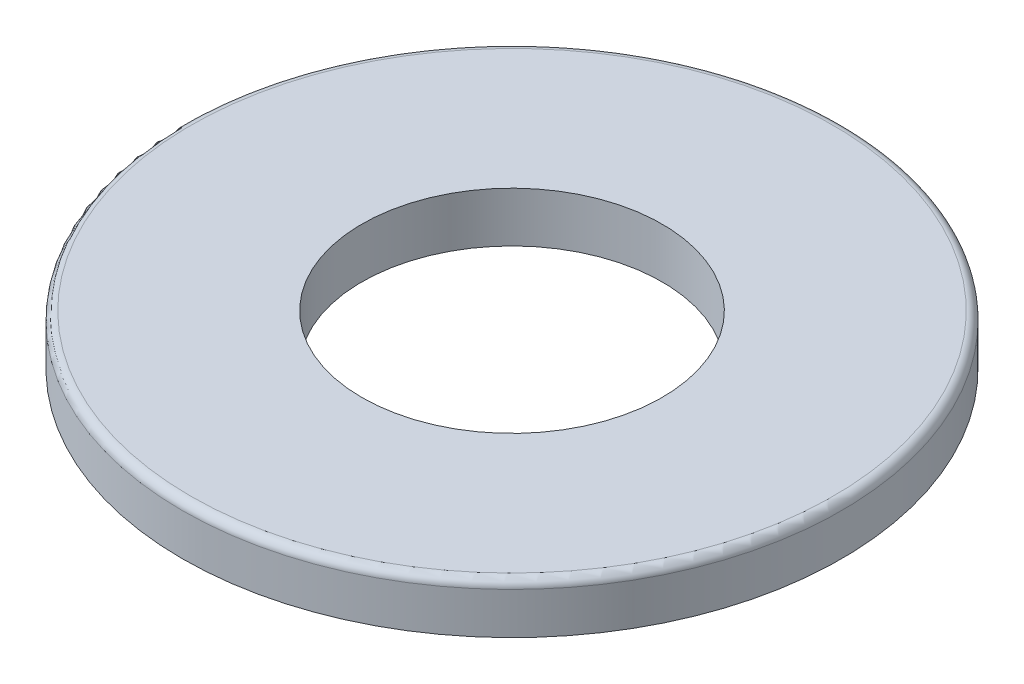
ISO-10303-21;
HEADER;
FILE_DESCRIPTION(('STEP AP214'),'2;1');
FILE_NAME('part.step','',(''),(''),'','','');
FILE_SCHEMA(('AUTOMOTIVE_DESIGN { 1 0 10303 214 1 1 1 1 }'));
ENDSEC;
DATA;
#1=APPLICATION_CONTEXT('core data for automotive mechanical design processes');
#2=APPLICATION_PROTOCOL_DEFINITION('international standard','automotive_design',2000,#1);
#3=PRODUCT_CONTEXT('',#1,'mechanical');
#4=PRODUCT('Part','Part','',(#3));
#5=PRODUCT_RELATED_PRODUCT_CATEGORY('part','',(#4));
#6=PRODUCT_DEFINITION_FORMATION('','',#4);
#7=PRODUCT_DEFINITION_CONTEXT('part definition',#1,'design');
#8=PRODUCT_DEFINITION('design','',#6,#7);
#9=PRODUCT_DEFINITION_SHAPE('','',#8);
#10=(LENGTH_UNIT() NAMED_UNIT(*) SI_UNIT(.MILLI.,.METRE.));
#11=(NAMED_UNIT(*) PLANE_ANGLE_UNIT() SI_UNIT($,.RADIAN.));
#12=(NAMED_UNIT(*) SI_UNIT($,.STERADIAN.) SOLID_ANGLE_UNIT());
#13=UNCERTAINTY_MEASURE_WITH_UNIT(LENGTH_MEASURE(1.E-05),#10,'distance_accuracy_value','');
#14=(GEOMETRIC_REPRESENTATION_CONTEXT(3) GLOBAL_UNCERTAINTY_ASSIGNED_CONTEXT((#13)) GLOBAL_UNIT_ASSIGNED_CONTEXT((#10,
#11,#12)) REPRESENTATION_CONTEXT('',''));
#15=CARTESIAN_POINT('',(0.,0.,0.));
#16=DIRECTION('',(0.,0.,1.));
#17=DIRECTION('',(1.,0.,0.));
#18=AXIS2_PLACEMENT_3D('',#15,#16,#17);
#19=CARTESIAN_POINT('',(0.,1.2,0.));
#20=DIRECTION('',(0.,-1.,0.));
#21=DIRECTION('',(0.,0.,-1.));
#22=AXIS2_PLACEMENT_3D('',#19,#20,#21);
#23=CYLINDRICAL_SURFACE('',#22,7.9);
#24=CARTESIAN_POINT('',(0.,1.,0.));
#25=DIRECTION('',(0.,1.,0.));
#26=DIRECTION('',(0.,0.,1.));
#27=AXIS2_PLACEMENT_3D('',#24,#25,#26);
#28=CIRCLE('',#27,7.9);
#29=CARTESIAN_POINT('',(0.,1.,7.9));
#30=VERTEX_POINT('',#29);
#31=EDGE_CURVE('E10',#30,#30,#28,.F.);
#32=ORIENTED_EDGE('',*,*,#31,.T.);
#33=EDGE_LOOP('',(#32));
#34=FACE_BOUND('',#33,.T.);
#35=CARTESIAN_POINT('',(0.,0.,0.));
#36=DIRECTION('',(0.,1.,0.));
#37=DIRECTION('',(0.,0.,1.));
#38=AXIS2_PLACEMENT_3D('',#35,#36,#37);
#39=CIRCLE('',#38,7.9);
#40=CARTESIAN_POINT('',(0.,0.,7.9));
#41=VERTEX_POINT('',#40);
#42=EDGE_CURVE('E42',#41,#41,#39,.T.);
#43=ORIENTED_EDGE('',*,*,#42,.T.);
#44=EDGE_LOOP('',(#43));
#45=FACE_BOUND('',#44,.T.);
#46=ADVANCED_FACE('F31',(#34,#45),#23,.T.);
#47=CARTESIAN_POINT('',(0.,1.2,0.));
#48=DIRECTION('',(0.,1.,0.));
#49=DIRECTION('',(0.,0.,1.));
#50=AXIS2_PLACEMENT_3D('',#47,#48,#49);
#51=PLANE('',#50);
#52=CARTESIAN_POINT('',(0.,1.2,0.));
#53=DIRECTION('',(0.,1.,0.));
#54=DIRECTION('',(0.,0.,1.));
#55=AXIS2_PLACEMENT_3D('',#52,#53,#54);
#56=CIRCLE('',#55,7.7);
#57=CARTESIAN_POINT('',(0.,1.2,7.7));
#58=VERTEX_POINT('',#57);
#59=EDGE_CURVE('E38',#58,#58,#56,.T.);
#60=ORIENTED_EDGE('',*,*,#59,.T.);
#61=EDGE_LOOP('',(#60));
#62=FACE_BOUND('',#61,.T.);
#63=CARTESIAN_POINT('',(0.,1.2,0.));
#64=DIRECTION('',(0.,1.,0.));
#65=DIRECTION('',(0.,0.,1.));
#66=AXIS2_PLACEMENT_3D('',#63,#64,#65);
#67=CIRCLE('',#66,3.6);
#68=CARTESIAN_POINT('',(0.,1.2,3.6));
#69=VERTEX_POINT('',#68);
#70=EDGE_CURVE('E49',#69,#69,#67,.T.);
#71=ORIENTED_EDGE('',*,*,#70,.F.);
#72=EDGE_LOOP('',(#71));
#73=FACE_BOUND('',#72,.T.);
#74=ADVANCED_FACE('F64',(#62,#73),#51,.T.);
#75=CARTESIAN_POINT('',(0.,0.,0.));
#76=DIRECTION('',(0.,1.,0.));
#77=DIRECTION('',(0.,0.,1.));
#78=AXIS2_PLACEMENT_3D('',#75,#76,#77);
#79=PLANE('',#78);
#80=CARTESIAN_POINT('',(0.,0.,0.));
#81=DIRECTION('',(0.,1.,0.));
#82=DIRECTION('',(0.,0.,1.));
#83=AXIS2_PLACEMENT_3D('',#80,#81,#82);
#84=CIRCLE('',#83,3.6);
#85=CARTESIAN_POINT('',(0.,0.,3.6));
#86=VERTEX_POINT('',#85);
#87=EDGE_CURVE('E46',#86,#86,#84,.T.);
#88=ORIENTED_EDGE('',*,*,#87,.T.);
#89=EDGE_LOOP('',(#88));
#90=FACE_BOUND('',#89,.T.);
#91=ORIENTED_EDGE('',*,*,#42,.F.);
#92=EDGE_LOOP('',(#91));
#93=FACE_BOUND('',#92,.T.);
#94=ADVANCED_FACE('F55',(#90,#93),#79,.F.);
#95=CARTESIAN_POINT('',(0.,0.,0.));
#96=DIRECTION('',(0.,1.,0.));
#97=DIRECTION('',(0.,0.,1.));
#98=AXIS2_PLACEMENT_3D('',#95,#96,#97);
#99=CYLINDRICAL_SURFACE('',#98,3.6);
#100=ORIENTED_EDGE('',*,*,#87,.F.);
#101=EDGE_LOOP('',(#100));
#102=FACE_BOUND('',#101,.T.);
#103=ORIENTED_EDGE('',*,*,#70,.T.);
#104=EDGE_LOOP('',(#103));
#105=FACE_BOUND('',#104,.T.);
#106=ADVANCED_FACE('F58',(#102,#105),#99,.F.);
#107=CARTESIAN_POINT('',(0.,1.,0.));
#108=DIRECTION('',(0.,1.,0.));
#109=DIRECTION('',(0.,0.,1.));
#110=AXIS2_PLACEMENT_3D('',#107,#108,#109);
#111=TOROIDAL_SURFACE('',#110,7.7,0.2);
#112=ORIENTED_EDGE('',*,*,#31,.F.);
#113=EDGE_LOOP('',(#112));
#114=FACE_BOUND('',#113,.T.);
#115=ORIENTED_EDGE('',*,*,#59,.F.);
#116=EDGE_LOOP('',(#115));
#117=FACE_BOUND('',#116,.T.);
#118=ADVANCED_FACE('F33',(#114,#117),#111,.T.);
#119=CLOSED_SHELL('',(#46,#74,#94,#106,#118));
#120=MANIFOLD_SOLID_BREP('B2',#119);
#121=ADVANCED_BREP_SHAPE_REPRESENTATION('',(#18,#120),#14);
#122=SHAPE_DEFINITION_REPRESENTATION(#9,#121);
ENDSEC;
END-ISO-10303-21;
